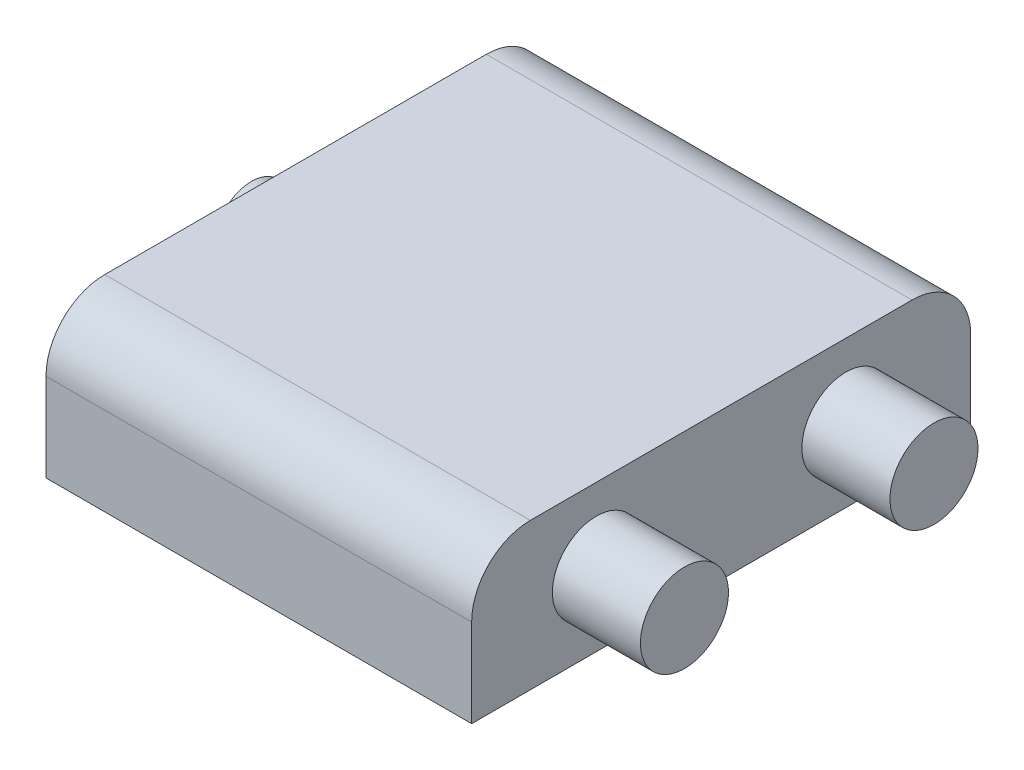
ISO-10303-21;
HEADER;
FILE_DESCRIPTION(('STEP AP214'),'2;1');
FILE_NAME('part.step','',(''),(''),'','','');
FILE_SCHEMA(('AUTOMOTIVE_DESIGN { 1 0 10303 214 1 1 1 1 }'));
ENDSEC;
DATA;
#1=APPLICATION_CONTEXT('core data for automotive mechanical design processes');
#2=APPLICATION_PROTOCOL_DEFINITION('international standard','automotive_design',2000,#1);
#3=PRODUCT_CONTEXT('',#1,'mechanical');
#4=PRODUCT('Part','Part','',(#3));
#5=PRODUCT_RELATED_PRODUCT_CATEGORY('part','',(#4));
#6=PRODUCT_DEFINITION_FORMATION('','',#4);
#7=PRODUCT_DEFINITION_CONTEXT('part definition',#1,'design');
#8=PRODUCT_DEFINITION('design','',#6,#7);
#9=PRODUCT_DEFINITION_SHAPE('','',#8);
#10=(LENGTH_UNIT() NAMED_UNIT(*) SI_UNIT(.MILLI.,.METRE.));
#11=(NAMED_UNIT(*) PLANE_ANGLE_UNIT() SI_UNIT($,.RADIAN.));
#12=(NAMED_UNIT(*) SI_UNIT($,.STERADIAN.) SOLID_ANGLE_UNIT());
#13=UNCERTAINTY_MEASURE_WITH_UNIT(LENGTH_MEASURE(1.E-05),#10,'distance_accuracy_value','');
#14=(GEOMETRIC_REPRESENTATION_CONTEXT(3) GLOBAL_UNCERTAINTY_ASSIGNED_CONTEXT((#13)) GLOBAL_UNIT_ASSIGNED_CONTEXT((#10,
#11,#12)) REPRESENTATION_CONTEXT('',''));
#15=CARTESIAN_POINT('',(0.,0.,0.));
#16=DIRECTION('',(0.,0.,1.));
#17=DIRECTION('',(1.,0.,0.));
#18=AXIS2_PLACEMENT_3D('',#15,#16,#17);
#19=CARTESIAN_POINT('',(29.,-5.,17.));
#20=DIRECTION('',(0.,0.,-1.));
#21=DIRECTION('',(-1.,0.,0.));
#22=AXIS2_PLACEMENT_3D('',#19,#20,#21);
#23=PLANE('',#22);
#24=DIRECTION('',(0.,-1.,0.));
#25=VECTOR('',#24,1.);
#26=CARTESIAN_POINT('',(29.,-5.,17.));
#27=LINE('',#26,#25);
#28=CARTESIAN_POINT('',(29.,1.,17.));
#29=VERTEX_POINT('',#28);
#30=CARTESIAN_POINT('',(29.,-5.,17.));
#31=VERTEX_POINT('',#30);
#32=EDGE_CURVE('E92',#29,#31,#27,.T.);
#33=ORIENTED_EDGE('',*,*,#32,.F.);
#34=DIRECTION('',(-1.,0.,0.));
#35=VECTOR('',#34,1.);
#36=CARTESIAN_POINT('',(29.,1.,17.));
#37=LINE('',#36,#35);
#38=CARTESIAN_POINT('',(0.,1.,17.));
#39=VERTEX_POINT('',#38);
#40=EDGE_CURVE('E116',#29,#39,#37,.T.);
#41=ORIENTED_EDGE('',*,*,#40,.T.);
#42=DIRECTION('',(0.,-1.,0.));
#43=VECTOR('',#42,1.);
#44=CARTESIAN_POINT('',(0.,-5.,17.));
#45=LINE('',#44,#43);
#46=CARTESIAN_POINT('',(0.,-5.,17.));
#47=VERTEX_POINT('',#46);
#48=EDGE_CURVE('E114',#39,#47,#45,.T.);
#49=ORIENTED_EDGE('',*,*,#48,.T.);
#50=DIRECTION('',(-1.,0.,0.));
#51=VECTOR('',#50,1.);
#52=CARTESIAN_POINT('',(29.,-5.,17.));
#53=LINE('',#52,#51);
#54=EDGE_CURVE('E108',#31,#47,#53,.T.);
#55=ORIENTED_EDGE('',*,*,#54,.F.);
#56=EDGE_LOOP('',(#33,#41,#49,#55));
#57=FACE_BOUND('',#56,.T.);
#58=ADVANCED_FACE('F36',(#57),#23,.F.);
#59=CARTESIAN_POINT('',(29.,-5.,-17.));
#60=DIRECTION('',(0.,1.,0.));
#61=DIRECTION('',(0.,0.,1.));
#62=AXIS2_PLACEMENT_3D('',#59,#60,#61);
#63=PLANE('',#62);
#64=DIRECTION('',(0.,0.,-1.));
#65=VECTOR('',#64,1.);
#66=CARTESIAN_POINT('',(0.,-5.,-17.));
#67=LINE('',#66,#65);
#68=CARTESIAN_POINT('',(0.,-5.,-17.));
#69=VERTEX_POINT('',#68);
#70=EDGE_CURVE('E171',#47,#69,#67,.T.);
#71=ORIENTED_EDGE('',*,*,#70,.T.);
#72=DIRECTION('',(-1.,0.,0.));
#73=VECTOR('',#72,1.);
#74=CARTESIAN_POINT('',(29.,-5.,-17.));
#75=LINE('',#74,#73);
#76=CARTESIAN_POINT('',(29.,-5.,-17.));
#77=VERTEX_POINT('',#76);
#78=EDGE_CURVE('E110',#77,#69,#75,.T.);
#79=ORIENTED_EDGE('',*,*,#78,.F.);
#80=DIRECTION('',(0.,0.,-1.));
#81=VECTOR('',#80,1.);
#82=CARTESIAN_POINT('',(29.,-5.,-17.));
#83=LINE('',#82,#81);
#84=EDGE_CURVE('E95',#31,#77,#83,.T.);
#85=ORIENTED_EDGE('',*,*,#84,.F.);
#86=ORIENTED_EDGE('',*,*,#54,.T.);
#87=EDGE_LOOP('',(#71,#79,#85,#86));
#88=FACE_BOUND('',#87,.T.);
#89=ADVANCED_FACE('F107',(#88),#63,.F.);
#90=CARTESIAN_POINT('',(29.,-5.,-17.));
#91=DIRECTION('',(0.,0.,1.));
#92=DIRECTION('',(1.,0.,0.));
#93=AXIS2_PLACEMENT_3D('',#90,#91,#92);
#94=PLANE('',#93);
#95=DIRECTION('',(0.,1.,0.));
#96=VECTOR('',#95,1.);
#97=CARTESIAN_POINT('',(0.,-5.,-17.));
#98=LINE('',#97,#96);
#99=CARTESIAN_POINT('',(0.,1.,-17.));
#100=VERTEX_POINT('',#99);
#101=EDGE_CURVE('E174',#69,#100,#98,.T.);
#102=ORIENTED_EDGE('',*,*,#101,.T.);
#103=DIRECTION('',(-1.,0.,0.));
#104=VECTOR('',#103,1.);
#105=CARTESIAN_POINT('',(29.,1.,-17.));
#106=LINE('',#105,#104);
#107=CARTESIAN_POINT('',(29.,1.,-17.));
#108=VERTEX_POINT('',#107);
#109=EDGE_CURVE('E51',#100,#108,#106,.F.);
#110=ORIENTED_EDGE('',*,*,#109,.T.);
#111=DIRECTION('',(0.,1.,0.));
#112=VECTOR('',#111,1.);
#113=CARTESIAN_POINT('',(29.,-5.,-17.));
#114=LINE('',#113,#112);
#115=EDGE_CURVE('E111',#77,#108,#114,.T.);
#116=ORIENTED_EDGE('',*,*,#115,.F.);
#117=ORIENTED_EDGE('',*,*,#78,.T.);
#118=EDGE_LOOP('',(#102,#110,#116,#117));
#119=FACE_BOUND('',#118,.T.);
#120=ADVANCED_FACE('F151',(#119),#94,.F.);
#121=CARTESIAN_POINT('',(29.,5.,-17.));
#122=DIRECTION('',(0.,-1.,0.));
#123=DIRECTION('',(0.,0.,-1.));
#124=AXIS2_PLACEMENT_3D('',#121,#122,#123);
#125=PLANE('',#124);
#126=DIRECTION('',(0.,0.,1.));
#127=VECTOR('',#126,1.);
#128=CARTESIAN_POINT('',(0.,5.,-17.));
#129=LINE('',#128,#127);
#130=CARTESIAN_POINT('',(0.,5.,-13.));
#131=VERTEX_POINT('',#130);
#132=CARTESIAN_POINT('',(0.,5.,13.));
#133=VERTEX_POINT('',#132);
#134=EDGE_CURVE('E103',#131,#133,#129,.T.);
#135=ORIENTED_EDGE('',*,*,#134,.T.);
#136=DIRECTION('',(-1.,0.,0.));
#137=VECTOR('',#136,1.);
#138=CARTESIAN_POINT('',(29.,5.,13.));
#139=LINE('',#138,#137);
#140=CARTESIAN_POINT('',(29.,5.,13.));
#141=VERTEX_POINT('',#140);
#142=EDGE_CURVE('E59',#133,#141,#139,.F.);
#143=ORIENTED_EDGE('',*,*,#142,.T.);
#144=DIRECTION('',(0.,0.,1.));
#145=VECTOR('',#144,1.);
#146=CARTESIAN_POINT('',(29.,5.,-17.));
#147=LINE('',#146,#145);
#148=CARTESIAN_POINT('',(29.,5.,-13.));
#149=VERTEX_POINT('',#148);
#150=EDGE_CURVE('E120',#149,#141,#147,.T.);
#151=ORIENTED_EDGE('',*,*,#150,.F.);
#152=DIRECTION('',(-1.,0.,0.));
#153=VECTOR('',#152,1.);
#154=CARTESIAN_POINT('',(29.,5.,-13.));
#155=LINE('',#154,#153);
#156=EDGE_CURVE('E127',#149,#131,#155,.T.);
#157=ORIENTED_EDGE('',*,*,#156,.T.);
#158=EDGE_LOOP('',(#135,#143,#151,#157));
#159=FACE_BOUND('',#158,.T.);
#160=ADVANCED_FACE('F141',(#159),#125,.F.);
#161=CARTESIAN_POINT('',(29.,0.,0.));
#162=DIRECTION('',(1.,0.,0.));
#163=DIRECTION('',(0.,0.,-1.));
#164=AXIS2_PLACEMENT_3D('',#161,#162,#163);
#165=PLANE('',#164);
#166=CARTESIAN_POINT('',(29.,0.,8.5));
#167=DIRECTION('',(1.,0.,0.));
#168=DIRECTION('',(0.,0.,-1.));
#169=AXIS2_PLACEMENT_3D('',#166,#167,#168);
#170=CIRCLE('',#169,3.);
#171=CARTESIAN_POINT('',(29.,0.,5.5));
#172=VERTEX_POINT('',#171);
#173=EDGE_CURVE('E185',#172,#172,#170,.T.);
#174=ORIENTED_EDGE('',*,*,#173,.F.);
#175=EDGE_LOOP('',(#174));
#176=FACE_BOUND('',#175,.T.);
#177=CARTESIAN_POINT('',(29.,0.,-8.5));
#178=DIRECTION('',(1.,0.,0.));
#179=DIRECTION('',(0.,0.,-1.));
#180=AXIS2_PLACEMENT_3D('',#177,#178,#179);
#181=CIRCLE('',#180,3.);
#182=CARTESIAN_POINT('',(29.,0.,-11.5));
#183=VERTEX_POINT('',#182);
#184=EDGE_CURVE('E44',#183,#183,#181,.T.);
#185=ORIENTED_EDGE('',*,*,#184,.F.);
#186=EDGE_LOOP('',(#185));
#187=FACE_BOUND('',#186,.T.);
#188=ORIENTED_EDGE('',*,*,#150,.T.);
#189=CARTESIAN_POINT('',(29.,1.,13.));
#190=DIRECTION('',(1.,0.,0.));
#191=DIRECTION('',(0.,0.,-1.));
#192=AXIS2_PLACEMENT_3D('',#189,#190,#191);
#193=CIRCLE('',#192,4.);
#194=EDGE_CURVE('E98',#141,#29,#193,.T.);
#195=ORIENTED_EDGE('',*,*,#194,.T.);
#196=ORIENTED_EDGE('',*,*,#32,.T.);
#197=ORIENTED_EDGE('',*,*,#84,.T.);
#198=ORIENTED_EDGE('',*,*,#115,.T.);
#199=CARTESIAN_POINT('',(29.,1.,-13.));
#200=DIRECTION('',(1.,0.,0.));
#201=DIRECTION('',(0.,0.,-1.));
#202=AXIS2_PLACEMENT_3D('',#199,#200,#201);
#203=CIRCLE('',#202,4.);
#204=EDGE_CURVE('E131',#108,#149,#203,.T.);
#205=ORIENTED_EDGE('',*,*,#204,.T.);
#206=EDGE_LOOP('',(#188,#195,#196,#197,#198,#205));
#207=FACE_BOUND('',#206,.T.);
#208=ADVANCED_FACE('F94',(#176,#187,#207),#165,.T.);
#209=CARTESIAN_POINT('',(0.,0.,0.));
#210=DIRECTION('',(1.,0.,0.));
#211=DIRECTION('',(0.,0.,-1.));
#212=AXIS2_PLACEMENT_3D('',#209,#210,#211);
#213=PLANE('',#212);
#214=CARTESIAN_POINT('',(0.,0.,0.));
#215=DIRECTION('',(1.,0.,0.));
#216=DIRECTION('',(0.,0.,-1.));
#217=AXIS2_PLACEMENT_3D('',#214,#215,#216);
#218=CIRCLE('',#217,2.5);
#219=CARTESIAN_POINT('',(0.,0.,-2.5));
#220=VERTEX_POINT('',#219);
#221=EDGE_CURVE('E11',#220,#220,#218,.F.);
#222=ORIENTED_EDGE('',*,*,#221,.F.);
#223=EDGE_LOOP('',(#222));
#224=FACE_BOUND('',#223,.T.);
#225=ORIENTED_EDGE('',*,*,#48,.F.);
#226=CARTESIAN_POINT('',(0.,1.,13.));
#227=DIRECTION('',(1.,0.,0.));
#228=DIRECTION('',(0.,0.,-1.));
#229=AXIS2_PLACEMENT_3D('',#226,#227,#228);
#230=CIRCLE('',#229,4.);
#231=EDGE_CURVE('E125',#39,#133,#230,.F.);
#232=ORIENTED_EDGE('',*,*,#231,.T.);
#233=ORIENTED_EDGE('',*,*,#134,.F.);
#234=CARTESIAN_POINT('',(0.,1.,-13.));
#235=DIRECTION('',(1.,0.,0.));
#236=DIRECTION('',(0.,0.,-1.));
#237=AXIS2_PLACEMENT_3D('',#234,#235,#236);
#238=CIRCLE('',#237,4.);
#239=EDGE_CURVE('E118',#131,#100,#238,.F.);
#240=ORIENTED_EDGE('',*,*,#239,.T.);
#241=ORIENTED_EDGE('',*,*,#101,.F.);
#242=ORIENTED_EDGE('',*,*,#70,.F.);
#243=EDGE_LOOP('',(#225,#232,#233,#240,#241,#242));
#244=FACE_BOUND('',#243,.T.);
#245=ADVANCED_FACE('F140',(#224,#244),#213,.F.);
#246=CARTESIAN_POINT('',(29.,1.,13.));
#247=DIRECTION('',(-1.,0.,0.));
#248=DIRECTION('',(0.,0.,1.));
#249=AXIS2_PLACEMENT_3D('',#246,#247,#248);
#250=CYLINDRICAL_SURFACE('',#249,4.);
#251=ORIENTED_EDGE('',*,*,#194,.F.);
#252=ORIENTED_EDGE('',*,*,#142,.F.);
#253=ORIENTED_EDGE('',*,*,#231,.F.);
#254=ORIENTED_EDGE('',*,*,#40,.F.);
#255=EDGE_LOOP('',(#251,#252,#253,#254));
#256=FACE_BOUND('',#255,.T.);
#257=ADVANCED_FACE('F148',(#256),#250,.T.);
#258=CARTESIAN_POINT('',(29.,1.,-13.));
#259=DIRECTION('',(-1.,0.,0.));
#260=DIRECTION('',(0.,0.,1.));
#261=AXIS2_PLACEMENT_3D('',#258,#259,#260);
#262=CYLINDRICAL_SURFACE('',#261,4.);
#263=ORIENTED_EDGE('',*,*,#204,.F.);
#264=ORIENTED_EDGE('',*,*,#109,.F.);
#265=ORIENTED_EDGE('',*,*,#239,.F.);
#266=ORIENTED_EDGE('',*,*,#156,.F.);
#267=EDGE_LOOP('',(#263,#264,#265,#266));
#268=FACE_BOUND('',#267,.T.);
#269=ADVANCED_FACE('F38',(#268),#262,.T.);
#270=CARTESIAN_POINT('',(35.,0.,-8.5));
#271=DIRECTION('',(-1.,0.,0.));
#272=DIRECTION('',(0.,0.,1.));
#273=AXIS2_PLACEMENT_3D('',#270,#271,#272);
#274=CYLINDRICAL_SURFACE('',#273,3.);
#275=CARTESIAN_POINT('',(35.,0.,-8.5));
#276=DIRECTION('',(1.,0.,0.));
#277=DIRECTION('',(0.,0.,-1.));
#278=AXIS2_PLACEMENT_3D('',#275,#276,#277);
#279=CIRCLE('',#278,3.);
#280=CARTESIAN_POINT('',(35.,0.,-11.5));
#281=VERTEX_POINT('',#280);
#282=EDGE_CURVE('E172',#281,#281,#279,.F.);
#283=ORIENTED_EDGE('',*,*,#282,.T.);
#284=EDGE_LOOP('',(#283));
#285=FACE_BOUND('',#284,.T.);
#286=ORIENTED_EDGE('',*,*,#184,.T.);
#287=EDGE_LOOP('',(#286));
#288=FACE_BOUND('',#287,.T.);
#289=ADVANCED_FACE('F137',(#285,#288),#274,.T.);
#290=CARTESIAN_POINT('',(35.,0.,0.));
#291=DIRECTION('',(1.,0.,0.));
#292=DIRECTION('',(0.,0.,-1.));
#293=AXIS2_PLACEMENT_3D('',#290,#291,#292);
#294=PLANE('',#293);
#295=ORIENTED_EDGE('',*,*,#282,.F.);
#296=EDGE_LOOP('',(#295));
#297=FACE_BOUND('',#296,.T.);
#298=ADVANCED_FACE('F213',(#297),#294,.T.);
#299=CARTESIAN_POINT('',(35.,0.,8.5));
#300=DIRECTION('',(-1.,0.,0.));
#301=DIRECTION('',(0.,0.,1.));
#302=AXIS2_PLACEMENT_3D('',#299,#300,#301);
#303=CYLINDRICAL_SURFACE('',#302,3.);
#304=CARTESIAN_POINT('',(35.,0.,8.5));
#305=DIRECTION('',(1.,0.,0.));
#306=DIRECTION('',(0.,0.,-1.));
#307=AXIS2_PLACEMENT_3D('',#304,#305,#306);
#308=CIRCLE('',#307,3.);
#309=CARTESIAN_POINT('',(35.,0.,5.5));
#310=VERTEX_POINT('',#309);
#311=EDGE_CURVE('E177',#310,#310,#308,.T.);
#312=ORIENTED_EDGE('',*,*,#311,.F.);
#313=EDGE_LOOP('',(#312));
#314=FACE_BOUND('',#313,.T.);
#315=ORIENTED_EDGE('',*,*,#173,.T.);
#316=EDGE_LOOP('',(#315));
#317=FACE_BOUND('',#316,.T.);
#318=ADVANCED_FACE('F207',(#314,#317),#303,.T.);
#319=CARTESIAN_POINT('',(35.,0.,0.));
#320=DIRECTION('',(1.,0.,0.));
#321=DIRECTION('',(0.,0.,-1.));
#322=AXIS2_PLACEMENT_3D('',#319,#320,#321);
#323=PLANE('',#322);
#324=ORIENTED_EDGE('',*,*,#311,.T.);
#325=EDGE_LOOP('',(#324));
#326=FACE_BOUND('',#325,.T.);
#327=ADVANCED_FACE('F199',(#326),#323,.T.);
#328=CARTESIAN_POINT('',(-3.,0.,0.));
#329=DIRECTION('',(1.,0.,0.));
#330=DIRECTION('',(0.,0.,-1.));
#331=AXIS2_PLACEMENT_3D('',#328,#329,#330);
#332=CYLINDRICAL_SURFACE('',#331,2.5);
#333=CARTESIAN_POINT('',(-3.,0.,0.));
#334=DIRECTION('',(-1.,0.,0.));
#335=DIRECTION('',(0.,0.,1.));
#336=AXIS2_PLACEMENT_3D('',#333,#334,#335);
#337=CIRCLE('',#336,2.5);
#338=CARTESIAN_POINT('',(-3.,0.,2.5));
#339=VERTEX_POINT('',#338);
#340=EDGE_CURVE('E188',#339,#339,#337,.T.);
#341=ORIENTED_EDGE('',*,*,#340,.F.);
#342=EDGE_LOOP('',(#341));
#343=FACE_BOUND('',#342,.T.);
#344=ORIENTED_EDGE('',*,*,#221,.T.);
#345=EDGE_LOOP('',(#344));
#346=FACE_BOUND('',#345,.T.);
#347=ADVANCED_FACE('F196',(#343,#346),#332,.T.);
#348=CARTESIAN_POINT('',(-3.,0.,0.));
#349=DIRECTION('',(-1.,0.,0.));
#350=DIRECTION('',(0.,0.,1.));
#351=AXIS2_PLACEMENT_3D('',#348,#349,#350);
#352=PLANE('',#351);
#353=ORIENTED_EDGE('',*,*,#340,.T.);
#354=EDGE_LOOP('',(#353));
#355=FACE_BOUND('',#354,.T.);
#356=ADVANCED_FACE('F194',(#355),#352,.T.);
#357=CLOSED_SHELL('',(#58,#89,#120,#160,#208,#245,#257,#269,#289,#298,#318,#327,#347,#356));
#358=MANIFOLD_SOLID_BREP('B2',#357);
#359=ADVANCED_BREP_SHAPE_REPRESENTATION('',(#18,#358),#14);
#360=SHAPE_DEFINITION_REPRESENTATION(#9,#359);
ENDSEC;
END-ISO-10303-21;
